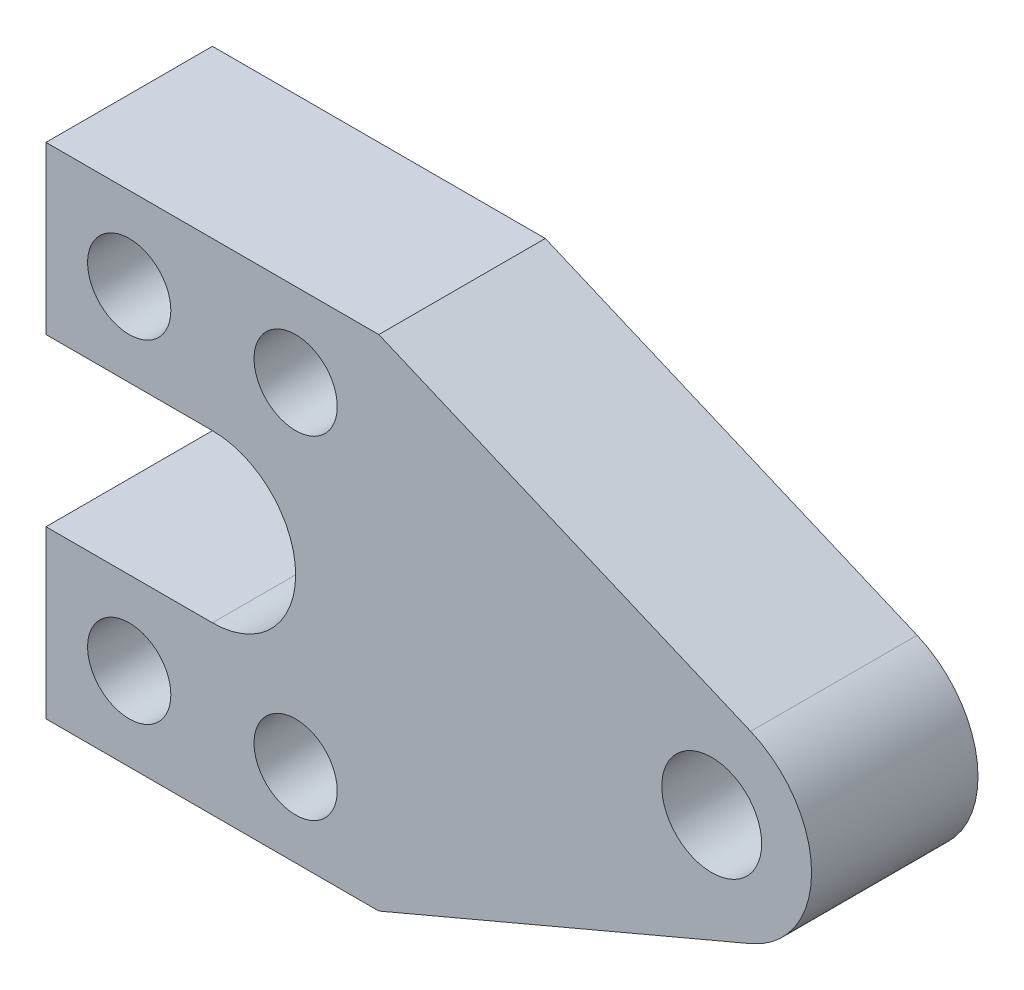
ISO-10303-21;
HEADER;
FILE_DESCRIPTION(('STEP AP214'),'2;1');
FILE_NAME('part.step','',(''),(''),'','','');
FILE_SCHEMA(('AUTOMOTIVE_DESIGN { 1 0 10303 214 1 1 1 1 }'));
ENDSEC;
DATA;
#1=APPLICATION_CONTEXT('core data for automotive mechanical design processes');
#2=APPLICATION_PROTOCOL_DEFINITION('international standard','automotive_design',2000,#1);
#3=PRODUCT_CONTEXT('',#1,'mechanical');
#4=PRODUCT('Part','Part','',(#3));
#5=PRODUCT_RELATED_PRODUCT_CATEGORY('part','',(#4));
#6=PRODUCT_DEFINITION_FORMATION('','',#4);
#7=PRODUCT_DEFINITION_CONTEXT('part definition',#1,'design');
#8=PRODUCT_DEFINITION('design','',#6,#7);
#9=PRODUCT_DEFINITION_SHAPE('','',#8);
#10=(LENGTH_UNIT() NAMED_UNIT(*) SI_UNIT(.MILLI.,.METRE.));
#11=(NAMED_UNIT(*) PLANE_ANGLE_UNIT() SI_UNIT($,.RADIAN.));
#12=(NAMED_UNIT(*) SI_UNIT($,.STERADIAN.) SOLID_ANGLE_UNIT());
#13=UNCERTAINTY_MEASURE_WITH_UNIT(LENGTH_MEASURE(1.E-05),#10,'distance_accuracy_value','');
#14=(GEOMETRIC_REPRESENTATION_CONTEXT(3) GLOBAL_UNCERTAINTY_ASSIGNED_CONTEXT((#13)) GLOBAL_UNIT_ASSIGNED_CONTEXT((#10,
#11,#12)) REPRESENTATION_CONTEXT('',''));
#15=CARTESIAN_POINT('',(0.,0.,0.));
#16=DIRECTION('',(0.,0.,1.));
#17=DIRECTION('',(1.,0.,0.));
#18=AXIS2_PLACEMENT_3D('',#15,#16,#17);
#19=CARTESIAN_POINT('',(90.,40.,20.));
#20=DIRECTION('',(0.,0.,1.));
#21=DIRECTION('',(1.,0.,0.));
#22=AXIS2_PLACEMENT_3D('',#19,#20,#21);
#23=PLANE('',#22);
#24=CARTESIAN_POINT('',(20.,60.,20.));
#25=DIRECTION('',(0.,0.,1.));
#26=DIRECTION('',(1.,0.,0.));
#27=AXIS2_PLACEMENT_3D('',#24,#25,#26);
#28=CIRCLE('',#27,5.);
#29=CARTESIAN_POINT('',(25.,60.,20.));
#30=VERTEX_POINT('',#29);
#31=EDGE_CURVE('E228',#30,#30,#28,.T.);
#32=ORIENTED_EDGE('',*,*,#31,.F.);
#33=EDGE_LOOP('',(#32));
#34=FACE_BOUND('',#33,.T.);
#35=CARTESIAN_POINT('',(20.,20.,20.));
#36=DIRECTION('',(0.,0.,1.));
#37=DIRECTION('',(1.,0.,0.));
#38=AXIS2_PLACEMENT_3D('',#35,#36,#37);
#39=CIRCLE('',#38,5.);
#40=CARTESIAN_POINT('',(25.,20.,20.));
#41=VERTEX_POINT('',#40);
#42=EDGE_CURVE('E216',#41,#41,#39,.T.);
#43=ORIENTED_EDGE('',*,*,#42,.F.);
#44=EDGE_LOOP('',(#43));
#45=FACE_BOUND('',#44,.T.);
#46=DIRECTION('',(0.,-1.,0.));
#47=VECTOR('',#46,1.);
#48=CARTESIAN_POINT('',(10.,30.,20.));
#49=LINE('',#48,#47);
#50=CARTESIAN_POINT('',(10.,30.,20.));
#51=VERTEX_POINT('',#50);
#52=CARTESIAN_POINT('',(10.,10.,20.));
#53=VERTEX_POINT('',#52);
#54=EDGE_CURVE('E165',#51,#53,#49,.T.);
#55=ORIENTED_EDGE('',*,*,#54,.T.);
#56=DIRECTION('',(1.,0.,0.));
#57=VECTOR('',#56,1.);
#58=CARTESIAN_POINT('',(10.,10.,20.));
#59=LINE('',#58,#57);
#60=CARTESIAN_POINT('',(50.,10.,20.));
#61=VERTEX_POINT('',#60);
#62=EDGE_CURVE('E103',#53,#61,#59,.T.);
#63=ORIENTED_EDGE('',*,*,#62,.T.);
#64=DIRECTION('',(0.920618310368742,0.390463732776557,0.));
#65=VECTOR('',#64,1.);
#66=CARTESIAN_POINT('',(50.,10.,20.));
#67=LINE('',#66,#65);
#68=CARTESIAN_POINT('',(94.6855647933187,28.9525802755751,20.));
#69=VERTEX_POINT('',#68);
#70=EDGE_CURVE('E186',#61,#69,#67,.T.);
#71=ORIENTED_EDGE('',*,*,#70,.T.);
#72=CARTESIAN_POINT('',(90.,40.,20.));
#73=DIRECTION('',(0.,0.,1.));
#74=DIRECTION('',(1.,0.,0.));
#75=AXIS2_PLACEMENT_3D('',#72,#73,#74);
#76=CIRCLE('',#75,12.);
#77=CARTESIAN_POINT('',(94.6855647933187,51.0474197244249,20.));
#78=VERTEX_POINT('',#77);
#79=EDGE_CURVE('E205',#69,#78,#76,.T.);
#80=ORIENTED_EDGE('',*,*,#79,.T.);
#81=DIRECTION('',(-0.920618310368742,0.390463732776557,0.));
#82=VECTOR('',#81,1.);
#83=CARTESIAN_POINT('',(94.6855647933187,51.0474197244249,20.));
#84=LINE('',#83,#82);
#85=CARTESIAN_POINT('',(50.,70.,20.));
#86=VERTEX_POINT('',#85);
#87=EDGE_CURVE('E202',#78,#86,#84,.T.);
#88=ORIENTED_EDGE('',*,*,#87,.T.);
#89=DIRECTION('',(-1.,0.,0.));
#90=VECTOR('',#89,1.);
#91=CARTESIAN_POINT('',(50.,70.,20.));
#92=LINE('',#91,#90);
#93=CARTESIAN_POINT('',(10.,70.,20.));
#94=VERTEX_POINT('',#93);
#95=EDGE_CURVE('E204',#86,#94,#92,.T.);
#96=ORIENTED_EDGE('',*,*,#95,.T.);
#97=DIRECTION('',(0.,-1.,0.));
#98=VECTOR('',#97,1.);
#99=CARTESIAN_POINT('',(10.,70.,20.));
#100=LINE('',#99,#98);
#101=CARTESIAN_POINT('',(10.,50.,20.));
#102=VERTEX_POINT('',#101);
#103=EDGE_CURVE('E128',#94,#102,#100,.T.);
#104=ORIENTED_EDGE('',*,*,#103,.T.);
#105=DIRECTION('',(1.,0.,0.));
#106=VECTOR('',#105,1.);
#107=CARTESIAN_POINT('',(10.,50.,20.));
#108=LINE('',#107,#106);
#109=CARTESIAN_POINT('',(30.,50.,20.));
#110=VERTEX_POINT('',#109);
#111=EDGE_CURVE('E122',#102,#110,#108,.T.);
#112=ORIENTED_EDGE('',*,*,#111,.T.);
#113=CARTESIAN_POINT('',(30.,40.,20.));
#114=DIRECTION('',(0.,0.,-1.));
#115=DIRECTION('',(-1.,0.,0.));
#116=AXIS2_PLACEMENT_3D('',#113,#114,#115);
#117=CIRCLE('',#116,10.);
#118=CARTESIAN_POINT('',(30.,30.,20.));
#119=VERTEX_POINT('',#118);
#120=EDGE_CURVE('E126',#110,#119,#117,.T.);
#121=ORIENTED_EDGE('',*,*,#120,.T.);
#122=DIRECTION('',(-1.,0.,0.));
#123=VECTOR('',#122,1.);
#124=CARTESIAN_POINT('',(30.,30.,20.));
#125=LINE('',#124,#123);
#126=EDGE_CURVE('E54',#119,#51,#125,.T.);
#127=ORIENTED_EDGE('',*,*,#126,.T.);
#128=EDGE_LOOP('',(#55,#63,#71,#80,#88,#96,#104,#112,#121,#127));
#129=FACE_BOUND('',#128,.T.);
#130=CARTESIAN_POINT('',(40.,60.,20.));
#131=DIRECTION('',(0.,0.,1.));
#132=DIRECTION('',(1.,0.,0.));
#133=AXIS2_PLACEMENT_3D('',#130,#131,#132);
#134=CIRCLE('',#133,5.);
#135=CARTESIAN_POINT('',(45.,60.,20.));
#136=VERTEX_POINT('',#135);
#137=EDGE_CURVE('E150',#136,#136,#134,.T.);
#138=ORIENTED_EDGE('',*,*,#137,.F.);
#139=EDGE_LOOP('',(#138));
#140=FACE_BOUND('',#139,.T.);
#141=CARTESIAN_POINT('',(40.,20.,20.));
#142=DIRECTION('',(0.,0.,1.));
#143=DIRECTION('',(1.,0.,0.));
#144=AXIS2_PLACEMENT_3D('',#141,#142,#143);
#145=CIRCLE('',#144,5.);
#146=CARTESIAN_POINT('',(45.,20.,20.));
#147=VERTEX_POINT('',#146);
#148=EDGE_CURVE('E222',#147,#147,#145,.T.);
#149=ORIENTED_EDGE('',*,*,#148,.F.);
#150=EDGE_LOOP('',(#149));
#151=FACE_BOUND('',#150,.T.);
#152=CARTESIAN_POINT('',(90.,40.,20.));
#153=DIRECTION('',(0.,0.,1.));
#154=DIRECTION('',(1.,0.,0.));
#155=AXIS2_PLACEMENT_3D('',#152,#153,#154);
#156=CIRCLE('',#155,6.);
#157=CARTESIAN_POINT('',(96.,40.,20.));
#158=VERTEX_POINT('',#157);
#159=EDGE_CURVE('E234',#158,#158,#156,.T.);
#160=ORIENTED_EDGE('',*,*,#159,.F.);
#161=EDGE_LOOP('',(#160));
#162=FACE_BOUND('',#161,.T.);
#163=ADVANCED_FACE('F37',(#34,#45,#129,#140,#151,#162),#23,.T.);
#164=CARTESIAN_POINT('',(90.,40.,0.));
#165=DIRECTION('',(0.,0.,1.));
#166=DIRECTION('',(1.,0.,0.));
#167=AXIS2_PLACEMENT_3D('',#164,#165,#166);
#168=PLANE('',#167);
#169=DIRECTION('',(0.,-1.,0.));
#170=VECTOR('',#169,1.);
#171=CARTESIAN_POINT('',(10.,30.,0.));
#172=LINE('',#171,#170);
#173=CARTESIAN_POINT('',(10.,30.,0.));
#174=VERTEX_POINT('',#173);
#175=CARTESIAN_POINT('',(10.,10.,0.));
#176=VERTEX_POINT('',#175);
#177=EDGE_CURVE('E146',#174,#176,#172,.T.);
#178=ORIENTED_EDGE('',*,*,#177,.F.);
#179=DIRECTION('',(-1.,0.,0.));
#180=VECTOR('',#179,1.);
#181=CARTESIAN_POINT('',(30.,30.,0.));
#182=LINE('',#181,#180);
#183=CARTESIAN_POINT('',(30.,30.,0.));
#184=VERTEX_POINT('',#183);
#185=EDGE_CURVE('E95',#184,#174,#182,.T.);
#186=ORIENTED_EDGE('',*,*,#185,.F.);
#187=CARTESIAN_POINT('',(30.,40.,0.));
#188=DIRECTION('',(0.,0.,-1.));
#189=DIRECTION('',(-1.,0.,0.));
#190=AXIS2_PLACEMENT_3D('',#187,#188,#189);
#191=CIRCLE('',#190,10.);
#192=CARTESIAN_POINT('',(30.,50.,0.));
#193=VERTEX_POINT('',#192);
#194=EDGE_CURVE('E89',#193,#184,#191,.T.);
#195=ORIENTED_EDGE('',*,*,#194,.F.);
#196=DIRECTION('',(1.,0.,0.));
#197=VECTOR('',#196,1.);
#198=CARTESIAN_POINT('',(10.,50.,0.));
#199=LINE('',#198,#197);
#200=CARTESIAN_POINT('',(10.,50.,0.));
#201=VERTEX_POINT('',#200);
#202=EDGE_CURVE('E136',#201,#193,#199,.T.);
#203=ORIENTED_EDGE('',*,*,#202,.F.);
#204=DIRECTION('',(0.,-1.,0.));
#205=VECTOR('',#204,1.);
#206=CARTESIAN_POINT('',(10.,70.,0.));
#207=LINE('',#206,#205);
#208=CARTESIAN_POINT('',(10.,70.,0.));
#209=VERTEX_POINT('',#208);
#210=EDGE_CURVE('E160',#209,#201,#207,.T.);
#211=ORIENTED_EDGE('',*,*,#210,.F.);
#212=DIRECTION('',(-1.,0.,0.));
#213=VECTOR('',#212,1.);
#214=CARTESIAN_POINT('',(50.,70.,0.));
#215=LINE('',#214,#213);
#216=CARTESIAN_POINT('',(50.,70.,0.));
#217=VERTEX_POINT('',#216);
#218=EDGE_CURVE('E158',#217,#209,#215,.T.);
#219=ORIENTED_EDGE('',*,*,#218,.F.);
#220=DIRECTION('',(-0.920618310368742,0.390463732776557,0.));
#221=VECTOR('',#220,1.);
#222=CARTESIAN_POINT('',(94.6855647933187,51.0474197244249,0.));
#223=LINE('',#222,#221);
#224=CARTESIAN_POINT('',(94.6855647933187,51.0474197244249,0.));
#225=VERTEX_POINT('',#224);
#226=EDGE_CURVE('E156',#225,#217,#223,.T.);
#227=ORIENTED_EDGE('',*,*,#226,.F.);
#228=CARTESIAN_POINT('',(90.,40.,0.));
#229=DIRECTION('',(0.,0.,1.));
#230=DIRECTION('',(1.,0.,0.));
#231=AXIS2_PLACEMENT_3D('',#228,#229,#230);
#232=CIRCLE('',#231,12.);
#233=CARTESIAN_POINT('',(94.6855647933187,28.9525802755751,0.));
#234=VERTEX_POINT('',#233);
#235=EDGE_CURVE('E154',#234,#225,#232,.T.);
#236=ORIENTED_EDGE('',*,*,#235,.F.);
#237=DIRECTION('',(0.920618310368742,0.390463732776557,0.));
#238=VECTOR('',#237,1.);
#239=CARTESIAN_POINT('',(50.,10.,0.));
#240=LINE('',#239,#238);
#241=CARTESIAN_POINT('',(50.,10.,0.));
#242=VERTEX_POINT('',#241);
#243=EDGE_CURVE('E152',#242,#234,#240,.T.);
#244=ORIENTED_EDGE('',*,*,#243,.F.);
#245=DIRECTION('',(1.,0.,0.));
#246=VECTOR('',#245,1.);
#247=CARTESIAN_POINT('',(10.,10.,0.));
#248=LINE('',#247,#246);
#249=EDGE_CURVE('E149',#176,#242,#248,.T.);
#250=ORIENTED_EDGE('',*,*,#249,.F.);
#251=EDGE_LOOP('',(#178,#186,#195,#203,#211,#219,#227,#236,#244,#250));
#252=FACE_BOUND('',#251,.T.);
#253=CARTESIAN_POINT('',(40.,60.,0.));
#254=DIRECTION('',(0.,0.,1.));
#255=DIRECTION('',(1.,0.,0.));
#256=AXIS2_PLACEMENT_3D('',#253,#254,#255);
#257=CIRCLE('',#256,5.);
#258=CARTESIAN_POINT('',(45.,60.,0.));
#259=VERTEX_POINT('',#258);
#260=EDGE_CURVE('E213',#259,#259,#257,.T.);
#261=ORIENTED_EDGE('',*,*,#260,.T.);
#262=EDGE_LOOP('',(#261));
#263=FACE_BOUND('',#262,.T.);
#264=CARTESIAN_POINT('',(20.,20.,0.));
#265=DIRECTION('',(0.,0.,1.));
#266=DIRECTION('',(1.,0.,0.));
#267=AXIS2_PLACEMENT_3D('',#264,#265,#266);
#268=CIRCLE('',#267,5.);
#269=CARTESIAN_POINT('',(25.,20.,0.));
#270=VERTEX_POINT('',#269);
#271=EDGE_CURVE('E219',#270,#270,#268,.T.);
#272=ORIENTED_EDGE('',*,*,#271,.T.);
#273=EDGE_LOOP('',(#272));
#274=FACE_BOUND('',#273,.T.);
#275=CARTESIAN_POINT('',(40.,20.,0.));
#276=DIRECTION('',(0.,0.,1.));
#277=DIRECTION('',(1.,0.,0.));
#278=AXIS2_PLACEMENT_3D('',#275,#276,#277);
#279=CIRCLE('',#278,5.);
#280=CARTESIAN_POINT('',(45.,20.,0.));
#281=VERTEX_POINT('',#280);
#282=EDGE_CURVE('E225',#281,#281,#279,.T.);
#283=ORIENTED_EDGE('',*,*,#282,.T.);
#284=EDGE_LOOP('',(#283));
#285=FACE_BOUND('',#284,.T.);
#286=CARTESIAN_POINT('',(20.,60.,0.));
#287=DIRECTION('',(0.,0.,1.));
#288=DIRECTION('',(1.,0.,0.));
#289=AXIS2_PLACEMENT_3D('',#286,#287,#288);
#290=CIRCLE('',#289,5.);
#291=CARTESIAN_POINT('',(25.,60.,0.));
#292=VERTEX_POINT('',#291);
#293=EDGE_CURVE('E231',#292,#292,#290,.T.);
#294=ORIENTED_EDGE('',*,*,#293,.T.);
#295=EDGE_LOOP('',(#294));
#296=FACE_BOUND('',#295,.T.);
#297=CARTESIAN_POINT('',(90.,40.,0.));
#298=DIRECTION('',(0.,0.,1.));
#299=DIRECTION('',(1.,0.,0.));
#300=AXIS2_PLACEMENT_3D('',#297,#298,#299);
#301=CIRCLE('',#300,6.);
#302=CARTESIAN_POINT('',(96.,40.,0.));
#303=VERTEX_POINT('',#302);
#304=EDGE_CURVE('E237',#303,#303,#301,.T.);
#305=ORIENTED_EDGE('',*,*,#304,.T.);
#306=EDGE_LOOP('',(#305));
#307=FACE_BOUND('',#306,.T.);
#308=ADVANCED_FACE('F190',(#252,#263,#274,#285,#296,#307),#168,.F.);
#309=CARTESIAN_POINT('',(10.,30.,20.));
#310=DIRECTION('',(1.,0.,0.));
#311=DIRECTION('',(0.,1.,0.));
#312=AXIS2_PLACEMENT_3D('',#309,#310,#311);
#313=PLANE('',#312);
#314=ORIENTED_EDGE('',*,*,#177,.T.);
#315=DIRECTION('',(0.,0.,-1.));
#316=VECTOR('',#315,1.);
#317=CARTESIAN_POINT('',(10.,10.,20.));
#318=LINE('',#317,#316);
#319=EDGE_CURVE('E11',#53,#176,#318,.T.);
#320=ORIENTED_EDGE('',*,*,#319,.F.);
#321=ORIENTED_EDGE('',*,*,#54,.F.);
#322=DIRECTION('',(0.,0.,-1.));
#323=VECTOR('',#322,1.);
#324=CARTESIAN_POINT('',(10.,30.,20.));
#325=LINE('',#324,#323);
#326=EDGE_CURVE('E142',#51,#174,#325,.T.);
#327=ORIENTED_EDGE('',*,*,#326,.T.);
#328=EDGE_LOOP('',(#314,#320,#321,#327));
#329=FACE_BOUND('',#328,.T.);
#330=ADVANCED_FACE('F39',(#329),#313,.F.);
#331=CARTESIAN_POINT('',(10.,10.,20.));
#332=DIRECTION('',(0.,1.,0.));
#333=DIRECTION('',(0.,0.,1.));
#334=AXIS2_PLACEMENT_3D('',#331,#332,#333);
#335=PLANE('',#334);
#336=ORIENTED_EDGE('',*,*,#249,.T.);
#337=DIRECTION('',(0.,0.,-1.));
#338=VECTOR('',#337,1.);
#339=CARTESIAN_POINT('',(50.,10.,20.));
#340=LINE('',#339,#338);
#341=EDGE_CURVE('E46',#61,#242,#340,.T.);
#342=ORIENTED_EDGE('',*,*,#341,.F.);
#343=ORIENTED_EDGE('',*,*,#62,.F.);
#344=ORIENTED_EDGE('',*,*,#319,.T.);
#345=EDGE_LOOP('',(#336,#342,#343,#344));
#346=FACE_BOUND('',#345,.T.);
#347=ADVANCED_FACE('F279',(#346),#335,.F.);
#348=CARTESIAN_POINT('',(50.,10.,20.));
#349=DIRECTION('',(-0.390463732776557,0.920618310368742,0.));
#350=DIRECTION('',(-0.920618310368742,-0.390463732776557,0.));
#351=AXIS2_PLACEMENT_3D('',#348,#349,#350);
#352=PLANE('',#351);
#353=ORIENTED_EDGE('',*,*,#243,.T.);
#354=DIRECTION('',(0.,0.,-1.));
#355=VECTOR('',#354,1.);
#356=CARTESIAN_POINT('',(94.6855647933187,28.9525802755751,20.));
#357=LINE('',#356,#355);
#358=EDGE_CURVE('E178',#69,#234,#357,.T.);
#359=ORIENTED_EDGE('',*,*,#358,.F.);
#360=ORIENTED_EDGE('',*,*,#70,.F.);
#361=ORIENTED_EDGE('',*,*,#341,.T.);
#362=EDGE_LOOP('',(#353,#359,#360,#361));
#363=FACE_BOUND('',#362,.T.);
#364=ADVANCED_FACE('F184',(#363),#352,.F.);
#365=CARTESIAN_POINT('',(90.,40.,20.));
#366=DIRECTION('',(0.,0.,-1.));
#367=DIRECTION('',(-1.,0.,0.));
#368=AXIS2_PLACEMENT_3D('',#365,#366,#367);
#369=CYLINDRICAL_SURFACE('',#368,12.);
#370=ORIENTED_EDGE('',*,*,#235,.T.);
#371=DIRECTION('',(0.,0.,-1.));
#372=VECTOR('',#371,1.);
#373=CARTESIAN_POINT('',(94.6855647933187,51.0474197244249,20.));
#374=LINE('',#373,#372);
#375=EDGE_CURVE('E175',#78,#225,#374,.T.);
#376=ORIENTED_EDGE('',*,*,#375,.F.);
#377=ORIENTED_EDGE('',*,*,#79,.F.);
#378=ORIENTED_EDGE('',*,*,#358,.T.);
#379=EDGE_LOOP('',(#370,#376,#377,#378));
#380=FACE_BOUND('',#379,.T.);
#381=ADVANCED_FACE('F196',(#380),#369,.T.);
#382=CARTESIAN_POINT('',(94.6855647933187,51.0474197244249,20.));
#383=DIRECTION('',(-0.390463732776557,-0.920618310368742,0.));
#384=DIRECTION('',(0.920618310368742,-0.390463732776557,0.));
#385=AXIS2_PLACEMENT_3D('',#382,#383,#384);
#386=PLANE('',#385);
#387=ORIENTED_EDGE('',*,*,#226,.T.);
#388=DIRECTION('',(0.,0.,-1.));
#389=VECTOR('',#388,1.);
#390=CARTESIAN_POINT('',(50.,70.,20.));
#391=LINE('',#390,#389);
#392=EDGE_CURVE('E172',#86,#217,#391,.T.);
#393=ORIENTED_EDGE('',*,*,#392,.F.);
#394=ORIENTED_EDGE('',*,*,#87,.F.);
#395=ORIENTED_EDGE('',*,*,#375,.T.);
#396=EDGE_LOOP('',(#387,#393,#394,#395));
#397=FACE_BOUND('',#396,.T.);
#398=ADVANCED_FACE('F200',(#397),#386,.F.);
#399=CARTESIAN_POINT('',(50.,70.,20.));
#400=DIRECTION('',(0.,-1.,0.));
#401=DIRECTION('',(1.,0.,0.));
#402=AXIS2_PLACEMENT_3D('',#399,#400,#401);
#403=PLANE('',#402);
#404=ORIENTED_EDGE('',*,*,#218,.T.);
#405=DIRECTION('',(0.,0.,-1.));
#406=VECTOR('',#405,1.);
#407=CARTESIAN_POINT('',(10.,70.,20.));
#408=LINE('',#407,#406);
#409=EDGE_CURVE('E169',#94,#209,#408,.T.);
#410=ORIENTED_EDGE('',*,*,#409,.F.);
#411=ORIENTED_EDGE('',*,*,#95,.F.);
#412=ORIENTED_EDGE('',*,*,#392,.T.);
#413=EDGE_LOOP('',(#404,#410,#411,#412));
#414=FACE_BOUND('',#413,.T.);
#415=ADVANCED_FACE('F269',(#414),#403,.F.);
#416=CARTESIAN_POINT('',(10.,70.,20.));
#417=DIRECTION('',(1.,0.,0.));
#418=DIRECTION('',(0.,1.,0.));
#419=AXIS2_PLACEMENT_3D('',#416,#417,#418);
#420=PLANE('',#419);
#421=ORIENTED_EDGE('',*,*,#210,.T.);
#422=DIRECTION('',(0.,0.,-1.));
#423=VECTOR('',#422,1.);
#424=CARTESIAN_POINT('',(10.,50.,20.));
#425=LINE('',#424,#423);
#426=EDGE_CURVE('E137',#102,#201,#425,.T.);
#427=ORIENTED_EDGE('',*,*,#426,.F.);
#428=ORIENTED_EDGE('',*,*,#103,.F.);
#429=ORIENTED_EDGE('',*,*,#409,.T.);
#430=EDGE_LOOP('',(#421,#427,#428,#429));
#431=FACE_BOUND('',#430,.T.);
#432=ADVANCED_FACE('F266',(#431),#420,.F.);
#433=CARTESIAN_POINT('',(10.,50.,20.));
#434=DIRECTION('',(0.,1.,0.));
#435=DIRECTION('',(-1.,0.,0.));
#436=AXIS2_PLACEMENT_3D('',#433,#434,#435);
#437=PLANE('',#436);
#438=ORIENTED_EDGE('',*,*,#202,.T.);
#439=DIRECTION('',(0.,0.,-1.));
#440=VECTOR('',#439,1.);
#441=CARTESIAN_POINT('',(30.,50.,20.));
#442=LINE('',#441,#440);
#443=EDGE_CURVE('E133',#110,#193,#442,.T.);
#444=ORIENTED_EDGE('',*,*,#443,.F.);
#445=ORIENTED_EDGE('',*,*,#111,.F.);
#446=ORIENTED_EDGE('',*,*,#426,.T.);
#447=EDGE_LOOP('',(#438,#444,#445,#446));
#448=FACE_BOUND('',#447,.T.);
#449=ADVANCED_FACE('F134',(#448),#437,.F.);
#450=CARTESIAN_POINT('',(30.,40.,20.));
#451=DIRECTION('',(0.,0.,-1.));
#452=DIRECTION('',(-1.,0.,0.));
#453=AXIS2_PLACEMENT_3D('',#450,#451,#452);
#454=CYLINDRICAL_SURFACE('',#453,10.);
#455=ORIENTED_EDGE('',*,*,#194,.T.);
#456=DIRECTION('',(0.,0.,-1.));
#457=VECTOR('',#456,1.);
#458=CARTESIAN_POINT('',(30.,30.,20.));
#459=LINE('',#458,#457);
#460=EDGE_CURVE('E138',#119,#184,#459,.T.);
#461=ORIENTED_EDGE('',*,*,#460,.F.);
#462=ORIENTED_EDGE('',*,*,#120,.F.);
#463=ORIENTED_EDGE('',*,*,#443,.T.);
#464=EDGE_LOOP('',(#455,#461,#462,#463));
#465=FACE_BOUND('',#464,.T.);
#466=ADVANCED_FACE('F140',(#465),#454,.F.);
#467=CARTESIAN_POINT('',(30.,30.,20.));
#468=DIRECTION('',(0.,-1.,0.));
#469=DIRECTION('',(0.,0.,-1.));
#470=AXIS2_PLACEMENT_3D('',#467,#468,#469);
#471=PLANE('',#470);
#472=ORIENTED_EDGE('',*,*,#185,.T.);
#473=ORIENTED_EDGE('',*,*,#326,.F.);
#474=ORIENTED_EDGE('',*,*,#126,.F.);
#475=ORIENTED_EDGE('',*,*,#460,.T.);
#476=EDGE_LOOP('',(#472,#473,#474,#475));
#477=FACE_BOUND('',#476,.T.);
#478=ADVANCED_FACE('F259',(#477),#471,.F.);
#479=CARTESIAN_POINT('',(40.,60.,20.));
#480=DIRECTION('',(0.,0.,-1.));
#481=DIRECTION('',(-1.,0.,0.));
#482=AXIS2_PLACEMENT_3D('',#479,#480,#481);
#483=CYLINDRICAL_SURFACE('',#482,5.);
#484=ORIENTED_EDGE('',*,*,#137,.T.);
#485=EDGE_LOOP('',(#484));
#486=FACE_BOUND('',#485,.T.);
#487=ORIENTED_EDGE('',*,*,#260,.F.);
#488=EDGE_LOOP('',(#487));
#489=FACE_BOUND('',#488,.T.);
#490=ADVANCED_FACE('F256',(#486,#489),#483,.F.);
#491=CARTESIAN_POINT('',(20.,20.,20.));
#492=DIRECTION('',(0.,0.,-1.));
#493=DIRECTION('',(-1.,0.,0.));
#494=AXIS2_PLACEMENT_3D('',#491,#492,#493);
#495=CYLINDRICAL_SURFACE('',#494,5.);
#496=ORIENTED_EDGE('',*,*,#42,.T.);
#497=EDGE_LOOP('',(#496));
#498=FACE_BOUND('',#497,.T.);
#499=ORIENTED_EDGE('',*,*,#271,.F.);
#500=EDGE_LOOP('',(#499));
#501=FACE_BOUND('',#500,.T.);
#502=ADVANCED_FACE('F369',(#498,#501),#495,.F.);
#503=CARTESIAN_POINT('',(40.,20.,20.));
#504=DIRECTION('',(0.,0.,-1.));
#505=DIRECTION('',(-1.,0.,0.));
#506=AXIS2_PLACEMENT_3D('',#503,#504,#505);
#507=CYLINDRICAL_SURFACE('',#506,5.);
#508=ORIENTED_EDGE('',*,*,#148,.T.);
#509=EDGE_LOOP('',(#508));
#510=FACE_BOUND('',#509,.T.);
#511=ORIENTED_EDGE('',*,*,#282,.F.);
#512=EDGE_LOOP('',(#511));
#513=FACE_BOUND('',#512,.T.);
#514=ADVANCED_FACE('F378',(#510,#513),#507,.F.);
#515=CARTESIAN_POINT('',(20.,60.,20.));
#516=DIRECTION('',(0.,0.,-1.));
#517=DIRECTION('',(-1.,0.,0.));
#518=AXIS2_PLACEMENT_3D('',#515,#516,#517);
#519=CYLINDRICAL_SURFACE('',#518,5.);
#520=ORIENTED_EDGE('',*,*,#31,.T.);
#521=EDGE_LOOP('',(#520));
#522=FACE_BOUND('',#521,.T.);
#523=ORIENTED_EDGE('',*,*,#293,.F.);
#524=EDGE_LOOP('',(#523));
#525=FACE_BOUND('',#524,.T.);
#526=ADVANCED_FACE('F387',(#522,#525),#519,.F.);
#527=CARTESIAN_POINT('',(90.,40.,20.));
#528=DIRECTION('',(0.,0.,-1.));
#529=DIRECTION('',(-1.,0.,0.));
#530=AXIS2_PLACEMENT_3D('',#527,#528,#529);
#531=CYLINDRICAL_SURFACE('',#530,6.);
#532=ORIENTED_EDGE('',*,*,#159,.T.);
#533=EDGE_LOOP('',(#532));
#534=FACE_BOUND('',#533,.T.);
#535=ORIENTED_EDGE('',*,*,#304,.F.);
#536=EDGE_LOOP('',(#535));
#537=FACE_BOUND('',#536,.T.);
#538=ADVANCED_FACE('F243',(#534,#537),#531,.F.);
#539=CLOSED_SHELL('',(#163,#308,#330,#347,#364,#381,#398,#415,#432,#449,#466,#478,#490,#502,
#514,#526,#538));
#540=MANIFOLD_SOLID_BREP('B2',#539);
#541=ADVANCED_BREP_SHAPE_REPRESENTATION('',(#18,#540),#14);
#542=SHAPE_DEFINITION_REPRESENTATION(#9,#541);
ENDSEC;
END-ISO-10303-21;
